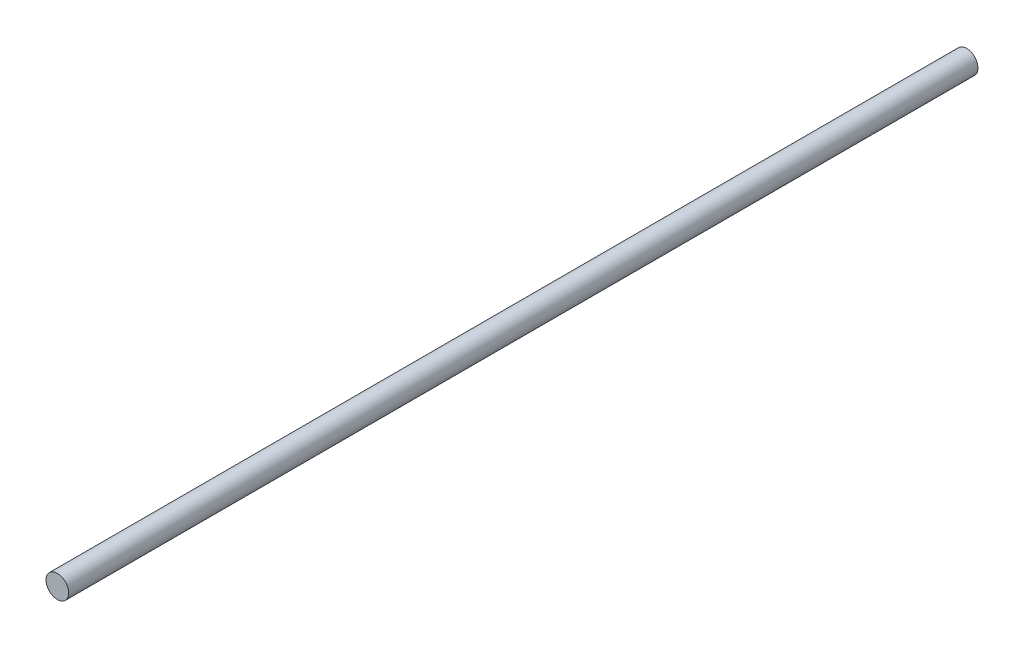
ISO-10303-21;
HEADER;
FILE_DESCRIPTION(('STEP AP214'),'2;1');
FILE_NAME('part.step','',(''),(''),'','','');
FILE_SCHEMA(('AUTOMOTIVE_DESIGN { 1 0 10303 214 1 1 1 1 }'));
ENDSEC;
DATA;
#1=APPLICATION_CONTEXT('core data for automotive mechanical design processes');
#2=APPLICATION_PROTOCOL_DEFINITION('international standard','automotive_design',2000,#1);
#3=PRODUCT_CONTEXT('',#1,'mechanical');
#4=PRODUCT('Part','Part','',(#3));
#5=PRODUCT_RELATED_PRODUCT_CATEGORY('part','',(#4));
#6=PRODUCT_DEFINITION_FORMATION('','',#4);
#7=PRODUCT_DEFINITION_CONTEXT('part definition',#1,'design');
#8=PRODUCT_DEFINITION('design','',#6,#7);
#9=PRODUCT_DEFINITION_SHAPE('','',#8);
#10=(LENGTH_UNIT() NAMED_UNIT(*) SI_UNIT(.MILLI.,.METRE.));
#11=(NAMED_UNIT(*) PLANE_ANGLE_UNIT() SI_UNIT($,.RADIAN.));
#12=(NAMED_UNIT(*) SI_UNIT($,.STERADIAN.) SOLID_ANGLE_UNIT());
#13=UNCERTAINTY_MEASURE_WITH_UNIT(LENGTH_MEASURE(1.E-05),#10,'distance_accuracy_value','');
#14=(GEOMETRIC_REPRESENTATION_CONTEXT(3) GLOBAL_UNCERTAINTY_ASSIGNED_CONTEXT((#13)) GLOBAL_UNIT_ASSIGNED_CONTEXT((#10,
#11,#12)) REPRESENTATION_CONTEXT('',''));
#15=CARTESIAN_POINT('',(0.,0.,0.));
#16=DIRECTION('',(0.,0.,1.));
#17=DIRECTION('',(1.,0.,0.));
#18=AXIS2_PLACEMENT_3D('',#15,#16,#17);
#19=CARTESIAN_POINT('',(0.,0.,400.));
#20=DIRECTION('',(0.,0.,-1.));
#21=DIRECTION('',(-1.,0.,0.));
#22=AXIS2_PLACEMENT_3D('',#19,#20,#21);
#23=CYLINDRICAL_SURFACE('',#22,5.);
#24=CARTESIAN_POINT('',(0.,0.,400.));
#25=DIRECTION('',(0.,0.,1.));
#26=DIRECTION('',(1.,0.,0.));
#27=AXIS2_PLACEMENT_3D('',#24,#25,#26);
#28=CIRCLE('',#27,5.);
#29=CARTESIAN_POINT('',(5.,0.,400.));
#30=VERTEX_POINT('',#29);
#31=EDGE_CURVE('E10',#30,#30,#28,.T.);
#32=ORIENTED_EDGE('',*,*,#31,.F.);
#33=EDGE_LOOP('',(#32));
#34=FACE_BOUND('',#33,.T.);
#35=CARTESIAN_POINT('',(0.,0.,0.));
#36=DIRECTION('',(0.,0.,1.));
#37=DIRECTION('',(1.,0.,0.));
#38=AXIS2_PLACEMENT_3D('',#35,#36,#37);
#39=CIRCLE('',#38,5.);
#40=CARTESIAN_POINT('',(5.,0.,0.));
#41=VERTEX_POINT('',#40);
#42=EDGE_CURVE('E40',#41,#41,#39,.T.);
#43=ORIENTED_EDGE('',*,*,#42,.T.);
#44=EDGE_LOOP('',(#43));
#45=FACE_BOUND('',#44,.T.);
#46=ADVANCED_FACE('F37',(#34,#45),#23,.T.);
#47=CARTESIAN_POINT('',(0.,0.,400.));
#48=DIRECTION('',(0.,0.,1.));
#49=DIRECTION('',(1.,0.,0.));
#50=AXIS2_PLACEMENT_3D('',#47,#48,#49);
#51=PLANE('',#50);
#52=ORIENTED_EDGE('',*,*,#31,.T.);
#53=EDGE_LOOP('',(#52));
#54=FACE_BOUND('',#53,.T.);
#55=ADVANCED_FACE('F54',(#54),#51,.T.);
#56=CARTESIAN_POINT('',(0.,0.,0.));
#57=DIRECTION('',(0.,0.,1.));
#58=DIRECTION('',(1.,0.,0.));
#59=AXIS2_PLACEMENT_3D('',#56,#57,#58);
#60=PLANE('',#59);
#61=ORIENTED_EDGE('',*,*,#42,.F.);
#62=EDGE_LOOP('',(#61));
#63=FACE_BOUND('',#62,.T.);
#64=ADVANCED_FACE('F52',(#63),#60,.F.);
#65=CLOSED_SHELL('',(#46,#55,#64));
#66=MANIFOLD_SOLID_BREP('B2',#65);
#67=ADVANCED_BREP_SHAPE_REPRESENTATION('',(#18,#66),#14);
#68=SHAPE_DEFINITION_REPRESENTATION(#9,#67);
ENDSEC;
END-ISO-10303-21;
